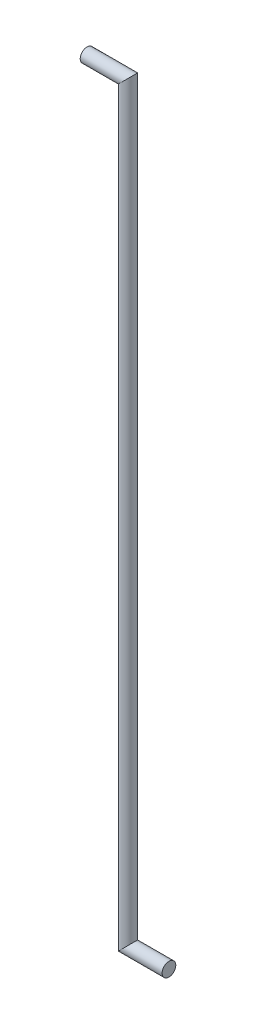
ISO-10303-21;
HEADER;
FILE_DESCRIPTION(('STEP AP214'),'2;1');
FILE_NAME('part.step','',(''),(''),'','','');
FILE_SCHEMA(('AUTOMOTIVE_DESIGN { 1 0 10303 214 1 1 1 1 }'));
ENDSEC;
DATA;
#1=APPLICATION_CONTEXT('core data for automotive mechanical design processes');
#2=APPLICATION_PROTOCOL_DEFINITION('international standard','automotive_design',2000,#1);
#3=PRODUCT_CONTEXT('',#1,'mechanical');
#4=PRODUCT('Part','Part','',(#3));
#5=PRODUCT_RELATED_PRODUCT_CATEGORY('part','',(#4));
#6=PRODUCT_DEFINITION_FORMATION('','',#4);
#7=PRODUCT_DEFINITION_CONTEXT('part definition',#1,'design');
#8=PRODUCT_DEFINITION('design','',#6,#7);
#9=PRODUCT_DEFINITION_SHAPE('','',#8);
#10=(LENGTH_UNIT() NAMED_UNIT(*) SI_UNIT(.MILLI.,.METRE.));
#11=(NAMED_UNIT(*) PLANE_ANGLE_UNIT() SI_UNIT($,.RADIAN.));
#12=(NAMED_UNIT(*) SI_UNIT($,.STERADIAN.) SOLID_ANGLE_UNIT());
#13=UNCERTAINTY_MEASURE_WITH_UNIT(LENGTH_MEASURE(1.E-05),#10,'distance_accuracy_value','');
#14=(GEOMETRIC_REPRESENTATION_CONTEXT(3) GLOBAL_UNCERTAINTY_ASSIGNED_CONTEXT((#13)) GLOBAL_UNIT_ASSIGNED_CONTEXT((#10,
#11,#12)) REPRESENTATION_CONTEXT('',''));
#15=CARTESIAN_POINT('',(0.,0.,0.));
#16=DIRECTION('',(0.,0.,1.));
#17=DIRECTION('',(1.,0.,0.));
#18=AXIS2_PLACEMENT_3D('',#15,#16,#17);
#19=CARTESIAN_POINT('',(3.00000000000001,-27.5,0.));
#20=DIRECTION('',(-1.,0.,0.));
#21=DIRECTION('',(0.,0.,1.));
#22=AXIS2_PLACEMENT_3D('',#19,#20,#21);
#23=PLANE('',#22);
#24=CARTESIAN_POINT('',(3.00000000000001,-27.5,0.));
#25=DIRECTION('',(-1.,0.,0.));
#26=DIRECTION('',(0.,0.,1.));
#27=AXIS2_PLACEMENT_3D('',#24,#25,#26);
#28=CIRCLE('',#27,0.5);
#29=CARTESIAN_POINT('',(3.00000000000001,-27.5,0.5));
#30=VERTEX_POINT('',#29);
#31=EDGE_CURVE('E55',#30,#30,#28,.T.);
#32=ORIENTED_EDGE('',*,*,#31,.F.);
#33=EDGE_LOOP('',(#32));
#34=FACE_BOUND('',#33,.T.);
#35=ADVANCED_FACE('F47',(#34),#23,.F.);
#36=CARTESIAN_POINT('',(-3.00000000000001,27.5,0.));
#37=DIRECTION('',(-1.,0.,0.));
#38=DIRECTION('',(0.,0.,1.));
#39=AXIS2_PLACEMENT_3D('',#36,#37,#38);
#40=PLANE('',#39);
#41=CARTESIAN_POINT('',(-3.00000000000001,27.5,0.));
#42=DIRECTION('',(-1.,0.,0.));
#43=DIRECTION('',(0.,0.,1.));
#44=AXIS2_PLACEMENT_3D('',#41,#42,#43);
#45=CIRCLE('',#44,0.5);
#46=CARTESIAN_POINT('',(-3.00000000000001,27.5,0.5));
#47=VERTEX_POINT('',#46);
#48=EDGE_CURVE('E60',#47,#47,#45,.T.);
#49=ORIENTED_EDGE('',*,*,#48,.T.);
#50=EDGE_LOOP('',(#49));
#51=FACE_BOUND('',#50,.T.);
#52=ADVANCED_FACE('F77',(#51),#40,.T.);
#53=CARTESIAN_POINT('',(-1.19999999999999,-27.5,0.));
#54=DIRECTION('',(1.,0.,0.));
#55=DIRECTION('',(0.,0.,-1.));
#56=AXIS2_PLACEMENT_3D('',#53,#54,#55);
#57=CYLINDRICAL_SURFACE('',#56,0.5);
#58=CARTESIAN_POINT('',(0.,-27.5,0.));
#59=DIRECTION('',(0.707106781186548,-0.707106781186547,0.));
#60=DIRECTION('',(-0.707106781186547,-0.707106781186548,0.));
#61=AXIS2_PLACEMENT_3D('',#58,#59,#60);
#62=ELLIPSE('',#61,0.707106781186547,0.5);
#63=CARTESIAN_POINT('',(-0.499999999999993,-28.,0.));
#64=VERTEX_POINT('',#63);
#65=EDGE_CURVE('E64',#64,#64,#62,.T.);
#66=ORIENTED_EDGE('',*,*,#65,.T.);
#67=EDGE_LOOP('',(#66));
#68=FACE_BOUND('',#67,.T.);
#69=ORIENTED_EDGE('',*,*,#31,.T.);
#70=EDGE_LOOP('',(#69));
#71=FACE_BOUND('',#70,.T.);
#72=ADVANCED_FACE('F71',(#68,#71),#57,.T.);
#73=CARTESIAN_POINT('',(0.,28.7,0.));
#74=DIRECTION('',(0.,-1.,0.));
#75=DIRECTION('',(1.,0.,0.));
#76=AXIS2_PLACEMENT_3D('',#73,#74,#75);
#77=CYLINDRICAL_SURFACE('',#76,0.5);
#78=CARTESIAN_POINT('',(0.,27.5,0.));
#79=DIRECTION('',(0.707106781186548,-0.707106781186547,0.));
#80=DIRECTION('',(0.707106781186547,0.707106781186548,0.));
#81=AXIS2_PLACEMENT_3D('',#78,#79,#80);
#82=ELLIPSE('',#81,0.707106781186547,0.5);
#83=CARTESIAN_POINT('',(0.499999999999983,28.,0.));
#84=VERTEX_POINT('',#83);
#85=EDGE_CURVE('E11',#84,#84,#82,.T.);
#86=ORIENTED_EDGE('',*,*,#85,.T.);
#87=EDGE_LOOP('',(#86));
#88=FACE_BOUND('',#87,.T.);
#89=ORIENTED_EDGE('',*,*,#65,.F.);
#90=EDGE_LOOP('',(#89));
#91=FACE_BOUND('',#90,.T.);
#92=ADVANCED_FACE('F84',(#88,#91),#77,.T.);
#93=CARTESIAN_POINT('',(-3.00000000000001,27.5,0.));
#94=DIRECTION('',(1.,0.,0.));
#95=DIRECTION('',(0.,0.,-1.));
#96=AXIS2_PLACEMENT_3D('',#93,#94,#95);
#97=CYLINDRICAL_SURFACE('',#96,0.5);
#98=ORIENTED_EDGE('',*,*,#48,.F.);
#99=EDGE_LOOP('',(#98));
#100=FACE_BOUND('',#99,.T.);
#101=ORIENTED_EDGE('',*,*,#85,.F.);
#102=EDGE_LOOP('',(#101));
#103=FACE_BOUND('',#102,.T.);
#104=ADVANCED_FACE('F81',(#100,#103),#97,.T.);
#105=CLOSED_SHELL('',(#35,#52,#72,#92,#104));
#106=MANIFOLD_SOLID_BREP('B2',#105);
#107=ADVANCED_BREP_SHAPE_REPRESENTATION('',(#18,#106),#14);
#108=SHAPE_DEFINITION_REPRESENTATION(#9,#107);
ENDSEC;
END-ISO-10303-21;
